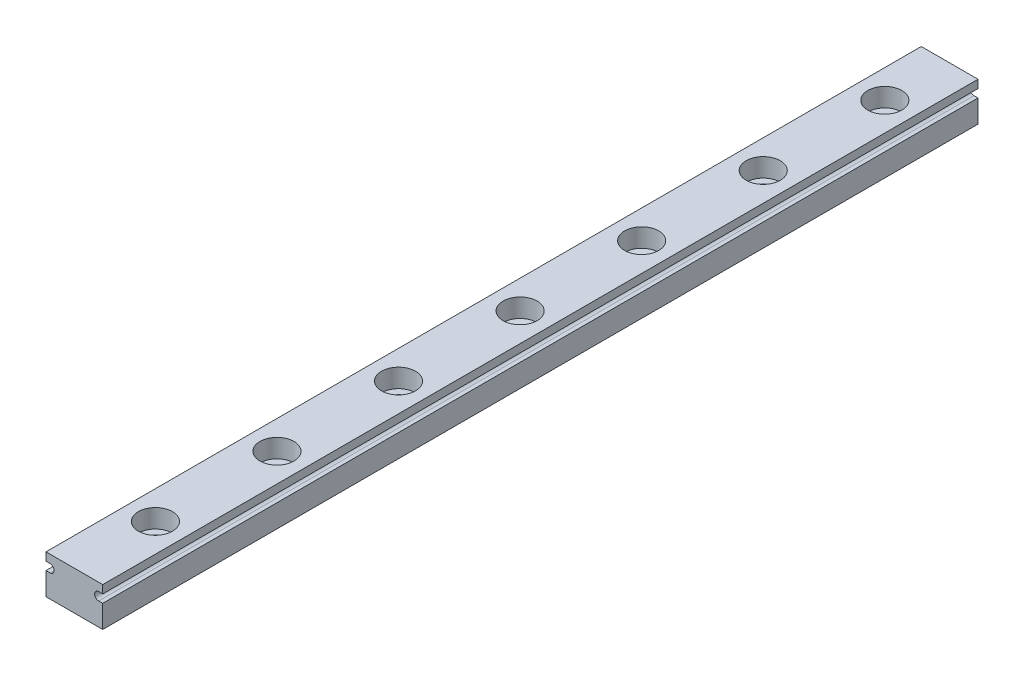
ISO-10303-21;
HEADER;
FILE_DESCRIPTION(('STEP AP214'),'2;1');
FILE_NAME('part.step','',(''),(''),'','','');
FILE_SCHEMA(('AUTOMOTIVE_DESIGN { 1 0 10303 214 1 1 1 1 }'));
ENDSEC;
DATA;
#1=APPLICATION_CONTEXT('core data for automotive mechanical design processes');
#2=APPLICATION_PROTOCOL_DEFINITION('international standard','automotive_design',2000,#1);
#3=PRODUCT_CONTEXT('',#1,'mechanical');
#4=PRODUCT('Part','Part','',(#3));
#5=PRODUCT_RELATED_PRODUCT_CATEGORY('part','',(#4));
#6=PRODUCT_DEFINITION_FORMATION('','',#4);
#7=PRODUCT_DEFINITION_CONTEXT('part definition',#1,'design');
#8=PRODUCT_DEFINITION('design','',#6,#7);
#9=PRODUCT_DEFINITION_SHAPE('','',#8);
#10=(LENGTH_UNIT() NAMED_UNIT(*) SI_UNIT(.MILLI.,.METRE.));
#11=(NAMED_UNIT(*) PLANE_ANGLE_UNIT() SI_UNIT($,.RADIAN.));
#12=(NAMED_UNIT(*) SI_UNIT($,.STERADIAN.) SOLID_ANGLE_UNIT());
#13=UNCERTAINTY_MEASURE_WITH_UNIT(LENGTH_MEASURE(1.E-05),#10,'distance_accuracy_value','');
#14=(GEOMETRIC_REPRESENTATION_CONTEXT(3) GLOBAL_UNCERTAINTY_ASSIGNED_CONTEXT((#13)) GLOBAL_UNIT_ASSIGNED_CONTEXT((#10,
#11,#12)) REPRESENTATION_CONTEXT('',''));
#15=CARTESIAN_POINT('',(0.,0.,0.));
#16=DIRECTION('',(0.,0.,1.));
#17=DIRECTION('',(1.,0.,0.));
#18=AXIS2_PLACEMENT_3D('',#15,#16,#17);
#19=CARTESIAN_POINT('',(-3.5,2.8,-108.));
#20=DIRECTION('',(-1.,0.,0.));
#21=DIRECTION('',(0.,-1.,0.));
#22=AXIS2_PLACEMENT_3D('',#19,#20,#21);
#23=PLANE('',#22);
#24=DIRECTION('',(0.,-1.,0.));
#25=VECTOR('',#24,1.);
#26=CARTESIAN_POINT('',(-3.5,2.8,0.));
#27=LINE('',#26,#25);
#28=CARTESIAN_POINT('',(-3.5,2.8,0.));
#29=VERTEX_POINT('',#28);
#30=CARTESIAN_POINT('',(-3.5,0.,0.));
#31=VERTEX_POINT('',#30);
#32=EDGE_CURVE('E155',#29,#31,#27,.T.);
#33=ORIENTED_EDGE('',*,*,#32,.F.);
#34=DIRECTION('',(0.,0.,1.));
#35=VECTOR('',#34,1.);
#36=CARTESIAN_POINT('',(-3.5,2.8,-108.));
#37=LINE('',#36,#35);
#38=CARTESIAN_POINT('',(-3.5,2.8,-108.));
#39=VERTEX_POINT('',#38);
#40=EDGE_CURVE('E11',#39,#29,#37,.T.);
#41=ORIENTED_EDGE('',*,*,#40,.F.);
#42=DIRECTION('',(0.,-1.,0.));
#43=VECTOR('',#42,1.);
#44=CARTESIAN_POINT('',(-3.5,2.8,-108.));
#45=LINE('',#44,#43);
#46=CARTESIAN_POINT('',(-3.5,0.,-108.));
#47=VERTEX_POINT('',#46);
#48=EDGE_CURVE('E188',#39,#47,#45,.T.);
#49=ORIENTED_EDGE('',*,*,#48,.T.);
#50=DIRECTION('',(0.,0.,1.));
#51=VECTOR('',#50,1.);
#52=CARTESIAN_POINT('',(-3.5,0.,-108.));
#53=LINE('',#52,#51);
#54=EDGE_CURVE('E37',#47,#31,#53,.T.);
#55=ORIENTED_EDGE('',*,*,#54,.T.);
#56=EDGE_LOOP('',(#33,#41,#49,#55));
#57=FACE_BOUND('',#56,.T.);
#58=ADVANCED_FACE('F34',(#57),#23,.T.);
#59=CARTESIAN_POINT('',(-3.,2.8,-108.));
#60=DIRECTION('',(0.,1.,0.));
#61=DIRECTION('',(0.,0.,1.));
#62=AXIS2_PLACEMENT_3D('',#59,#60,#61);
#63=PLANE('',#62);
#64=DIRECTION('',(-1.,0.,0.));
#65=VECTOR('',#64,1.);
#66=CARTESIAN_POINT('',(-3.,2.8,0.));
#67=LINE('',#66,#65);
#68=CARTESIAN_POINT('',(-3.,2.8,0.));
#69=VERTEX_POINT('',#68);
#70=EDGE_CURVE('E186',#69,#29,#67,.T.);
#71=ORIENTED_EDGE('',*,*,#70,.F.);
#72=DIRECTION('',(0.,0.,1.));
#73=VECTOR('',#72,1.);
#74=CARTESIAN_POINT('',(-3.,2.8,-108.));
#75=LINE('',#74,#73);
#76=CARTESIAN_POINT('',(-3.,2.8,-108.));
#77=VERTEX_POINT('',#76);
#78=EDGE_CURVE('E43',#77,#69,#75,.T.);
#79=ORIENTED_EDGE('',*,*,#78,.F.);
#80=DIRECTION('',(-1.,0.,0.));
#81=VECTOR('',#80,1.);
#82=CARTESIAN_POINT('',(-3.,2.8,-108.));
#83=LINE('',#82,#81);
#84=EDGE_CURVE('E145',#77,#39,#83,.T.);
#85=ORIENTED_EDGE('',*,*,#84,.T.);
#86=ORIENTED_EDGE('',*,*,#40,.T.);
#87=EDGE_LOOP('',(#71,#79,#85,#86));
#88=FACE_BOUND('',#87,.T.);
#89=ADVANCED_FACE('F208',(#88),#63,.T.);
#90=CARTESIAN_POINT('',(-3.,3.3,-108.));
#91=DIRECTION('',(0.,0.,1.));
#92=DIRECTION('',(1.,0.,0.));
#93=AXIS2_PLACEMENT_3D('',#90,#91,#92);
#94=CYLINDRICAL_SURFACE('',#93,0.5);
#95=CARTESIAN_POINT('',(-3.,3.3,0.));
#96=DIRECTION('',(0.,0.,-1.));
#97=DIRECTION('',(-1.,0.,0.));
#98=AXIS2_PLACEMENT_3D('',#95,#96,#97);
#99=CIRCLE('',#98,0.5);
#100=CARTESIAN_POINT('',(-3.,3.8,0.));
#101=VERTEX_POINT('',#100);
#102=EDGE_CURVE('E132',#101,#69,#99,.T.);
#103=ORIENTED_EDGE('',*,*,#102,.F.);
#104=DIRECTION('',(0.,0.,1.));
#105=VECTOR('',#104,1.);
#106=CARTESIAN_POINT('',(-3.,3.8,-108.));
#107=LINE('',#106,#105);
#108=CARTESIAN_POINT('',(-3.,3.8,-108.));
#109=VERTEX_POINT('',#108);
#110=EDGE_CURVE('E127',#109,#101,#107,.T.);
#111=ORIENTED_EDGE('',*,*,#110,.F.);
#112=CARTESIAN_POINT('',(-3.,3.3,-108.));
#113=DIRECTION('',(0.,0.,-1.));
#114=DIRECTION('',(-1.,0.,0.));
#115=AXIS2_PLACEMENT_3D('',#112,#113,#114);
#116=CIRCLE('',#115,0.5);
#117=EDGE_CURVE('E130',#109,#77,#116,.T.);
#118=ORIENTED_EDGE('',*,*,#117,.T.);
#119=ORIENTED_EDGE('',*,*,#78,.T.);
#120=EDGE_LOOP('',(#103,#111,#118,#119));
#121=FACE_BOUND('',#120,.T.);
#122=ADVANCED_FACE('F129',(#121),#94,.F.);
#123=CARTESIAN_POINT('',(-3.,3.8,-108.));
#124=DIRECTION('',(0.,-1.,0.));
#125=DIRECTION('',(0.,0.,-1.));
#126=AXIS2_PLACEMENT_3D('',#123,#124,#125);
#127=PLANE('',#126);
#128=DIRECTION('',(1.,0.,0.));
#129=VECTOR('',#128,1.);
#130=CARTESIAN_POINT('',(-3.,3.8,0.));
#131=LINE('',#130,#129);
#132=CARTESIAN_POINT('',(-3.5,3.8,0.));
#133=VERTEX_POINT('',#132);
#134=EDGE_CURVE('E183',#133,#101,#131,.T.);
#135=ORIENTED_EDGE('',*,*,#134,.F.);
#136=DIRECTION('',(0.,0.,1.));
#137=VECTOR('',#136,1.);
#138=CARTESIAN_POINT('',(-3.5,3.8,-108.));
#139=LINE('',#138,#137);
#140=CARTESIAN_POINT('',(-3.5,3.8,-108.));
#141=VERTEX_POINT('',#140);
#142=EDGE_CURVE('E137',#141,#133,#139,.T.);
#143=ORIENTED_EDGE('',*,*,#142,.F.);
#144=DIRECTION('',(1.,0.,0.));
#145=VECTOR('',#144,1.);
#146=CARTESIAN_POINT('',(-3.,3.8,-108.));
#147=LINE('',#146,#145);
#148=EDGE_CURVE('E143',#141,#109,#147,.T.);
#149=ORIENTED_EDGE('',*,*,#148,.T.);
#150=ORIENTED_EDGE('',*,*,#110,.T.);
#151=EDGE_LOOP('',(#135,#143,#149,#150));
#152=FACE_BOUND('',#151,.T.);
#153=ADVANCED_FACE('F147',(#152),#127,.T.);
#154=CARTESIAN_POINT('',(-3.5,4.8,-108.));
#155=DIRECTION('',(-1.,0.,0.));
#156=DIRECTION('',(0.,-1.,0.));
#157=AXIS2_PLACEMENT_3D('',#154,#155,#156);
#158=PLANE('',#157);
#159=DIRECTION('',(0.,-1.,0.));
#160=VECTOR('',#159,1.);
#161=CARTESIAN_POINT('',(-3.5,4.8,0.));
#162=LINE('',#161,#160);
#163=CARTESIAN_POINT('',(-3.5,4.8,0.));
#164=VERTEX_POINT('',#163);
#165=EDGE_CURVE('E180',#164,#133,#162,.T.);
#166=ORIENTED_EDGE('',*,*,#165,.F.);
#167=DIRECTION('',(0.,0.,1.));
#168=VECTOR('',#167,1.);
#169=CARTESIAN_POINT('',(-3.5,4.8,-108.));
#170=LINE('',#169,#168);
#171=CARTESIAN_POINT('',(-3.5,4.8,-108.));
#172=VERTEX_POINT('',#171);
#173=EDGE_CURVE('E192',#172,#164,#170,.T.);
#174=ORIENTED_EDGE('',*,*,#173,.F.);
#175=DIRECTION('',(0.,-1.,0.));
#176=VECTOR('',#175,1.);
#177=CARTESIAN_POINT('',(-3.5,4.8,-108.));
#178=LINE('',#177,#176);
#179=EDGE_CURVE('E148',#172,#141,#178,.T.);
#180=ORIENTED_EDGE('',*,*,#179,.T.);
#181=ORIENTED_EDGE('',*,*,#142,.T.);
#182=EDGE_LOOP('',(#166,#174,#180,#181));
#183=FACE_BOUND('',#182,.T.);
#184=ADVANCED_FACE('F221',(#183),#158,.T.);
#185=CARTESIAN_POINT('',(-3.5,4.8,-108.));
#186=DIRECTION('',(0.,1.,0.));
#187=DIRECTION('',(0.,0.,1.));
#188=AXIS2_PLACEMENT_3D('',#185,#186,#187);
#189=PLANE('',#188);
#190=CARTESIAN_POINT('',(0.,4.8,-100.));
#191=DIRECTION('',(0.,1.,0.));
#192=DIRECTION('',(0.,0.,1.));
#193=AXIS2_PLACEMENT_3D('',#190,#191,#192);
#194=CIRCLE('',#193,2.1);
#195=CARTESIAN_POINT('',(0.,4.8,-97.9));
#196=VERTEX_POINT('',#195);
#197=EDGE_CURVE('E426',#196,#196,#194,.T.);
#198=ORIENTED_EDGE('',*,*,#197,.F.);
#199=EDGE_LOOP('',(#198));
#200=FACE_BOUND('',#199,.T.);
#201=CARTESIAN_POINT('',(0.,4.8,-85.));
#202=DIRECTION('',(0.,1.,0.));
#203=DIRECTION('',(0.,0.,1.));
#204=AXIS2_PLACEMENT_3D('',#201,#202,#203);
#205=CIRCLE('',#204,2.1);
#206=CARTESIAN_POINT('',(0.,4.8,-82.9));
#207=VERTEX_POINT('',#206);
#208=EDGE_CURVE('E439',#207,#207,#205,.T.);
#209=ORIENTED_EDGE('',*,*,#208,.F.);
#210=EDGE_LOOP('',(#209));
#211=FACE_BOUND('',#210,.T.);
#212=CARTESIAN_POINT('',(0.,4.8,-70.));
#213=DIRECTION('',(0.,1.,0.));
#214=DIRECTION('',(0.,0.,1.));
#215=AXIS2_PLACEMENT_3D('',#212,#213,#214);
#216=CIRCLE('',#215,2.1);
#217=CARTESIAN_POINT('',(0.,4.8,-67.9));
#218=VERTEX_POINT('',#217);
#219=EDGE_CURVE('E449',#218,#218,#216,.T.);
#220=ORIENTED_EDGE('',*,*,#219,.F.);
#221=EDGE_LOOP('',(#220));
#222=FACE_BOUND('',#221,.T.);
#223=CARTESIAN_POINT('',(0.,4.8,-55.));
#224=DIRECTION('',(0.,1.,0.));
#225=DIRECTION('',(0.,0.,1.));
#226=AXIS2_PLACEMENT_3D('',#223,#224,#225);
#227=CIRCLE('',#226,2.1);
#228=CARTESIAN_POINT('',(0.,4.8,-52.9));
#229=VERTEX_POINT('',#228);
#230=EDGE_CURVE('E459',#229,#229,#227,.T.);
#231=ORIENTED_EDGE('',*,*,#230,.F.);
#232=EDGE_LOOP('',(#231));
#233=FACE_BOUND('',#232,.T.);
#234=CARTESIAN_POINT('',(0.,4.8,-40.));
#235=DIRECTION('',(0.,1.,0.));
#236=DIRECTION('',(0.,0.,1.));
#237=AXIS2_PLACEMENT_3D('',#234,#235,#236);
#238=CIRCLE('',#237,2.1);
#239=CARTESIAN_POINT('',(0.,4.8,-37.9));
#240=VERTEX_POINT('',#239);
#241=EDGE_CURVE('E469',#240,#240,#238,.T.);
#242=ORIENTED_EDGE('',*,*,#241,.F.);
#243=EDGE_LOOP('',(#242));
#244=FACE_BOUND('',#243,.T.);
#245=CARTESIAN_POINT('',(0.,4.8,-25.));
#246=DIRECTION('',(0.,1.,0.));
#247=DIRECTION('',(0.,0.,1.));
#248=AXIS2_PLACEMENT_3D('',#245,#246,#247);
#249=CIRCLE('',#248,2.1);
#250=CARTESIAN_POINT('',(0.,4.8,-22.9));
#251=VERTEX_POINT('',#250);
#252=EDGE_CURVE('E282',#251,#251,#249,.T.);
#253=ORIENTED_EDGE('',*,*,#252,.F.);
#254=EDGE_LOOP('',(#253));
#255=FACE_BOUND('',#254,.T.);
#256=CARTESIAN_POINT('',(0.,4.8,-9.99999999999999));
#257=DIRECTION('',(0.,1.,0.));
#258=DIRECTION('',(0.,0.,1.));
#259=AXIS2_PLACEMENT_3D('',#256,#257,#258);
#260=CIRCLE('',#259,2.1);
#261=CARTESIAN_POINT('',(0.,4.8,-7.89999999999999));
#262=VERTEX_POINT('',#261);
#263=EDGE_CURVE('E159',#262,#262,#260,.T.);
#264=ORIENTED_EDGE('',*,*,#263,.F.);
#265=EDGE_LOOP('',(#264));
#266=FACE_BOUND('',#265,.T.);
#267=DIRECTION('',(-1.,0.,0.));
#268=VECTOR('',#267,1.);
#269=CARTESIAN_POINT('',(-3.5,4.8,0.));
#270=LINE('',#269,#268);
#271=CARTESIAN_POINT('',(3.5,4.8,0.));
#272=VERTEX_POINT('',#271);
#273=EDGE_CURVE('E177',#272,#164,#270,.T.);
#274=ORIENTED_EDGE('',*,*,#273,.F.);
#275=DIRECTION('',(0.,0.,1.));
#276=VECTOR('',#275,1.);
#277=CARTESIAN_POINT('',(3.5,4.8,-108.));
#278=LINE('',#277,#276);
#279=CARTESIAN_POINT('',(3.5,4.8,-108.));
#280=VERTEX_POINT('',#279);
#281=EDGE_CURVE('E194',#280,#272,#278,.T.);
#282=ORIENTED_EDGE('',*,*,#281,.F.);
#283=DIRECTION('',(-1.,0.,0.));
#284=VECTOR('',#283,1.);
#285=CARTESIAN_POINT('',(-3.5,4.8,-108.));
#286=LINE('',#285,#284);
#287=EDGE_CURVE('E150',#280,#172,#286,.T.);
#288=ORIENTED_EDGE('',*,*,#287,.T.);
#289=ORIENTED_EDGE('',*,*,#173,.T.);
#290=EDGE_LOOP('',(#274,#282,#288,#289));
#291=FACE_BOUND('',#290,.T.);
#292=ADVANCED_FACE('F224',(#200,#211,#222,#233,#244,#255,#266,#291),#189,.T.);
#293=CARTESIAN_POINT('',(3.5,4.8,-108.));
#294=DIRECTION('',(1.,0.,0.));
#295=DIRECTION('',(0.,1.,0.));
#296=AXIS2_PLACEMENT_3D('',#293,#294,#295);
#297=PLANE('',#296);
#298=DIRECTION('',(0.,1.,0.));
#299=VECTOR('',#298,1.);
#300=CARTESIAN_POINT('',(3.5,4.8,0.));
#301=LINE('',#300,#299);
#302=CARTESIAN_POINT('',(3.5,3.8,0.));
#303=VERTEX_POINT('',#302);
#304=EDGE_CURVE('E174',#303,#272,#301,.T.);
#305=ORIENTED_EDGE('',*,*,#304,.F.);
#306=DIRECTION('',(0.,0.,1.));
#307=VECTOR('',#306,1.);
#308=CARTESIAN_POINT('',(3.5,3.8,-108.));
#309=LINE('',#308,#307);
#310=CARTESIAN_POINT('',(3.5,3.8,-108.));
#311=VERTEX_POINT('',#310);
#312=EDGE_CURVE('E196',#311,#303,#309,.T.);
#313=ORIENTED_EDGE('',*,*,#312,.F.);
#314=DIRECTION('',(0.,1.,0.));
#315=VECTOR('',#314,1.);
#316=CARTESIAN_POINT('',(3.5,4.8,-108.));
#317=LINE('',#316,#315);
#318=EDGE_CURVE('E311',#311,#280,#317,.T.);
#319=ORIENTED_EDGE('',*,*,#318,.T.);
#320=ORIENTED_EDGE('',*,*,#281,.T.);
#321=EDGE_LOOP('',(#305,#313,#319,#320));
#322=FACE_BOUND('',#321,.T.);
#323=ADVANCED_FACE('F228',(#322),#297,.T.);
#324=CARTESIAN_POINT('',(3.,3.8,-108.));
#325=DIRECTION('',(0.,-1.,0.));
#326=DIRECTION('',(0.,0.,-1.));
#327=AXIS2_PLACEMENT_3D('',#324,#325,#326);
#328=PLANE('',#327);
#329=DIRECTION('',(1.,0.,0.));
#330=VECTOR('',#329,1.);
#331=CARTESIAN_POINT('',(3.,3.8,0.));
#332=LINE('',#331,#330);
#333=CARTESIAN_POINT('',(3.,3.8,0.));
#334=VERTEX_POINT('',#333);
#335=EDGE_CURVE('E171',#334,#303,#332,.T.);
#336=ORIENTED_EDGE('',*,*,#335,.F.);
#337=DIRECTION('',(0.,0.,1.));
#338=VECTOR('',#337,1.);
#339=CARTESIAN_POINT('',(3.,3.8,-108.));
#340=LINE('',#339,#338);
#341=CARTESIAN_POINT('',(3.,3.8,-108.));
#342=VERTEX_POINT('',#341);
#343=EDGE_CURVE('E198',#342,#334,#340,.T.);
#344=ORIENTED_EDGE('',*,*,#343,.F.);
#345=DIRECTION('',(1.,0.,0.));
#346=VECTOR('',#345,1.);
#347=CARTESIAN_POINT('',(3.,3.8,-108.));
#348=LINE('',#347,#346);
#349=EDGE_CURVE('E308',#342,#311,#348,.T.);
#350=ORIENTED_EDGE('',*,*,#349,.T.);
#351=ORIENTED_EDGE('',*,*,#312,.T.);
#352=EDGE_LOOP('',(#336,#344,#350,#351));
#353=FACE_BOUND('',#352,.T.);
#354=ADVANCED_FACE('F232',(#353),#328,.T.);
#355=CARTESIAN_POINT('',(3.,3.3,-108.));
#356=DIRECTION('',(0.,0.,1.));
#357=DIRECTION('',(1.,0.,0.));
#358=AXIS2_PLACEMENT_3D('',#355,#356,#357);
#359=CYLINDRICAL_SURFACE('',#358,0.5);
#360=CARTESIAN_POINT('',(3.,3.3,0.));
#361=DIRECTION('',(0.,0.,-1.));
#362=DIRECTION('',(1.,0.,0.));
#363=AXIS2_PLACEMENT_3D('',#360,#361,#362);
#364=CIRCLE('',#363,0.5);
#365=CARTESIAN_POINT('',(3.,2.8,0.));
#366=VERTEX_POINT('',#365);
#367=EDGE_CURVE('E168',#366,#334,#364,.T.);
#368=ORIENTED_EDGE('',*,*,#367,.F.);
#369=DIRECTION('',(0.,0.,1.));
#370=VECTOR('',#369,1.);
#371=CARTESIAN_POINT('',(3.,2.8,-108.));
#372=LINE('',#371,#370);
#373=CARTESIAN_POINT('',(3.,2.8,-108.));
#374=VERTEX_POINT('',#373);
#375=EDGE_CURVE('E200',#374,#366,#372,.T.);
#376=ORIENTED_EDGE('',*,*,#375,.F.);
#377=CARTESIAN_POINT('',(3.,3.3,-108.));
#378=DIRECTION('',(0.,0.,-1.));
#379=DIRECTION('',(1.,0.,0.));
#380=AXIS2_PLACEMENT_3D('',#377,#378,#379);
#381=CIRCLE('',#380,0.5);
#382=EDGE_CURVE('E305',#374,#342,#381,.T.);
#383=ORIENTED_EDGE('',*,*,#382,.T.);
#384=ORIENTED_EDGE('',*,*,#343,.T.);
#385=EDGE_LOOP('',(#368,#376,#383,#384));
#386=FACE_BOUND('',#385,.T.);
#387=ADVANCED_FACE('F236',(#386),#359,.F.);
#388=CARTESIAN_POINT('',(3.,2.8,-108.));
#389=DIRECTION('',(0.,1.,0.));
#390=DIRECTION('',(0.,0.,1.));
#391=AXIS2_PLACEMENT_3D('',#388,#389,#390);
#392=PLANE('',#391);
#393=DIRECTION('',(-1.,0.,0.));
#394=VECTOR('',#393,1.);
#395=CARTESIAN_POINT('',(3.,2.8,0.));
#396=LINE('',#395,#394);
#397=CARTESIAN_POINT('',(3.5,2.8,0.));
#398=VERTEX_POINT('',#397);
#399=EDGE_CURVE('E165',#398,#366,#396,.T.);
#400=ORIENTED_EDGE('',*,*,#399,.F.);
#401=DIRECTION('',(0.,0.,1.));
#402=VECTOR('',#401,1.);
#403=CARTESIAN_POINT('',(3.5,2.8,-108.));
#404=LINE('',#403,#402);
#405=CARTESIAN_POINT('',(3.5,2.8,-108.));
#406=VERTEX_POINT('',#405);
#407=EDGE_CURVE('E202',#406,#398,#404,.T.);
#408=ORIENTED_EDGE('',*,*,#407,.F.);
#409=DIRECTION('',(-1.,0.,0.));
#410=VECTOR('',#409,1.);
#411=CARTESIAN_POINT('',(3.,2.8,-108.));
#412=LINE('',#411,#410);
#413=EDGE_CURVE('E302',#406,#374,#412,.T.);
#414=ORIENTED_EDGE('',*,*,#413,.T.);
#415=ORIENTED_EDGE('',*,*,#375,.T.);
#416=EDGE_LOOP('',(#400,#408,#414,#415));
#417=FACE_BOUND('',#416,.T.);
#418=ADVANCED_FACE('F240',(#417),#392,.T.);
#419=CARTESIAN_POINT('',(3.5,2.8,-108.));
#420=DIRECTION('',(1.,0.,0.));
#421=DIRECTION('',(0.,1.,0.));
#422=AXIS2_PLACEMENT_3D('',#419,#420,#421);
#423=PLANE('',#422);
#424=DIRECTION('',(0.,1.,0.));
#425=VECTOR('',#424,1.);
#426=CARTESIAN_POINT('',(3.5,2.8,0.));
#427=LINE('',#426,#425);
#428=CARTESIAN_POINT('',(3.5,0.,0.));
#429=VERTEX_POINT('',#428);
#430=EDGE_CURVE('E162',#429,#398,#427,.T.);
#431=ORIENTED_EDGE('',*,*,#430,.F.);
#432=DIRECTION('',(0.,0.,1.));
#433=VECTOR('',#432,1.);
#434=CARTESIAN_POINT('',(3.5,0.,-108.));
#435=LINE('',#434,#433);
#436=CARTESIAN_POINT('',(3.5,0.,-108.));
#437=VERTEX_POINT('',#436);
#438=EDGE_CURVE('E203',#437,#429,#435,.T.);
#439=ORIENTED_EDGE('',*,*,#438,.F.);
#440=DIRECTION('',(0.,1.,0.));
#441=VECTOR('',#440,1.);
#442=CARTESIAN_POINT('',(3.5,2.8,-108.));
#443=LINE('',#442,#441);
#444=EDGE_CURVE('E299',#437,#406,#443,.T.);
#445=ORIENTED_EDGE('',*,*,#444,.T.);
#446=ORIENTED_EDGE('',*,*,#407,.T.);
#447=EDGE_LOOP('',(#431,#439,#445,#446));
#448=FACE_BOUND('',#447,.T.);
#449=ADVANCED_FACE('F244',(#448),#423,.T.);
#450=CARTESIAN_POINT('',(-3.5,0.,-108.));
#451=DIRECTION('',(0.,-1.,0.));
#452=DIRECTION('',(0.,0.,-1.));
#453=AXIS2_PLACEMENT_3D('',#450,#451,#452);
#454=PLANE('',#453);
#455=CARTESIAN_POINT('',(0.,0.,-100.));
#456=DIRECTION('',(0.,1.,0.));
#457=DIRECTION('',(0.,0.,1.));
#458=AXIS2_PLACEMENT_3D('',#455,#456,#457);
#459=CIRCLE('',#458,1.19999999999999);
#460=CARTESIAN_POINT('',(0.,0.,-98.8));
#461=VERTEX_POINT('',#460);
#462=EDGE_CURVE('E256',#461,#461,#459,.T.);
#463=ORIENTED_EDGE('',*,*,#462,.T.);
#464=EDGE_LOOP('',(#463));
#465=FACE_BOUND('',#464,.T.);
#466=CARTESIAN_POINT('',(0.,0.,-85.));
#467=DIRECTION('',(0.,1.,0.));
#468=DIRECTION('',(0.,0.,1.));
#469=AXIS2_PLACEMENT_3D('',#466,#467,#468);
#470=CIRCLE('',#469,1.19999999999999);
#471=CARTESIAN_POINT('',(0.,0.,-83.8));
#472=VERTEX_POINT('',#471);
#473=EDGE_CURVE('E260',#472,#472,#470,.T.);
#474=ORIENTED_EDGE('',*,*,#473,.T.);
#475=EDGE_LOOP('',(#474));
#476=FACE_BOUND('',#475,.T.);
#477=CARTESIAN_POINT('',(0.,0.,-70.));
#478=DIRECTION('',(0.,1.,0.));
#479=DIRECTION('',(0.,0.,1.));
#480=AXIS2_PLACEMENT_3D('',#477,#478,#479);
#481=CIRCLE('',#480,1.19999999999999);
#482=CARTESIAN_POINT('',(0.,0.,-68.8));
#483=VERTEX_POINT('',#482);
#484=EDGE_CURVE('E264',#483,#483,#481,.T.);
#485=ORIENTED_EDGE('',*,*,#484,.T.);
#486=EDGE_LOOP('',(#485));
#487=FACE_BOUND('',#486,.T.);
#488=CARTESIAN_POINT('',(0.,0.,-55.));
#489=DIRECTION('',(0.,1.,0.));
#490=DIRECTION('',(0.,0.,1.));
#491=AXIS2_PLACEMENT_3D('',#488,#489,#490);
#492=CIRCLE('',#491,1.19999999999999);
#493=CARTESIAN_POINT('',(0.,0.,-53.8));
#494=VERTEX_POINT('',#493);
#495=EDGE_CURVE('E268',#494,#494,#492,.T.);
#496=ORIENTED_EDGE('',*,*,#495,.T.);
#497=EDGE_LOOP('',(#496));
#498=FACE_BOUND('',#497,.T.);
#499=CARTESIAN_POINT('',(0.,0.,-40.));
#500=DIRECTION('',(0.,1.,0.));
#501=DIRECTION('',(0.,0.,1.));
#502=AXIS2_PLACEMENT_3D('',#499,#500,#501);
#503=CIRCLE('',#502,1.19999999999999);
#504=CARTESIAN_POINT('',(0.,0.,-38.8));
#505=VERTEX_POINT('',#504);
#506=EDGE_CURVE('E272',#505,#505,#503,.T.);
#507=ORIENTED_EDGE('',*,*,#506,.T.);
#508=EDGE_LOOP('',(#507));
#509=FACE_BOUND('',#508,.T.);
#510=CARTESIAN_POINT('',(0.,0.,-25.));
#511=DIRECTION('',(0.,1.,0.));
#512=DIRECTION('',(0.,0.,1.));
#513=AXIS2_PLACEMENT_3D('',#510,#511,#512);
#514=CIRCLE('',#513,1.19999999999999);
#515=CARTESIAN_POINT('',(0.,0.,-23.8));
#516=VERTEX_POINT('',#515);
#517=EDGE_CURVE('E276',#516,#516,#514,.T.);
#518=ORIENTED_EDGE('',*,*,#517,.T.);
#519=EDGE_LOOP('',(#518));
#520=FACE_BOUND('',#519,.T.);
#521=CARTESIAN_POINT('',(0.,0.,-9.99999999999999));
#522=DIRECTION('',(0.,1.,0.));
#523=DIRECTION('',(0.,0.,1.));
#524=AXIS2_PLACEMENT_3D('',#521,#522,#523);
#525=CIRCLE('',#524,1.19999999999999);
#526=CARTESIAN_POINT('',(0.,0.,-8.8));
#527=VERTEX_POINT('',#526);
#528=EDGE_CURVE('E279',#527,#527,#525,.T.);
#529=ORIENTED_EDGE('',*,*,#528,.T.);
#530=EDGE_LOOP('',(#529));
#531=FACE_BOUND('',#530,.T.);
#532=DIRECTION('',(1.,0.,0.));
#533=VECTOR('',#532,1.);
#534=CARTESIAN_POINT('',(-3.5,0.,0.));
#535=LINE('',#534,#533);
#536=EDGE_CURVE('E158',#31,#429,#535,.T.);
#537=ORIENTED_EDGE('',*,*,#536,.F.);
#538=ORIENTED_EDGE('',*,*,#54,.F.);
#539=DIRECTION('',(1.,0.,0.));
#540=VECTOR('',#539,1.);
#541=CARTESIAN_POINT('',(-3.5,0.,-108.));
#542=LINE('',#541,#540);
#543=EDGE_CURVE('E297',#47,#437,#542,.T.);
#544=ORIENTED_EDGE('',*,*,#543,.T.);
#545=ORIENTED_EDGE('',*,*,#438,.T.);
#546=EDGE_LOOP('',(#537,#538,#544,#545));
#547=FACE_BOUND('',#546,.T.);
#548=ADVANCED_FACE('F205',(#465,#476,#487,#498,#509,#520,#531,#547),#454,.T.);
#549=CARTESIAN_POINT('',(3.,3.3,-108.));
#550=DIRECTION('',(0.,0.,1.));
#551=DIRECTION('',(1.,0.,0.));
#552=AXIS2_PLACEMENT_3D('',#549,#550,#551);
#553=PLANE('',#552);
#554=ORIENTED_EDGE('',*,*,#48,.F.);
#555=ORIENTED_EDGE('',*,*,#84,.F.);
#556=ORIENTED_EDGE('',*,*,#117,.F.);
#557=ORIENTED_EDGE('',*,*,#148,.F.);
#558=ORIENTED_EDGE('',*,*,#179,.F.);
#559=ORIENTED_EDGE('',*,*,#287,.F.);
#560=ORIENTED_EDGE('',*,*,#318,.F.);
#561=ORIENTED_EDGE('',*,*,#349,.F.);
#562=ORIENTED_EDGE('',*,*,#382,.F.);
#563=ORIENTED_EDGE('',*,*,#413,.F.);
#564=ORIENTED_EDGE('',*,*,#444,.F.);
#565=ORIENTED_EDGE('',*,*,#543,.F.);
#566=EDGE_LOOP('',(#554,#555,#556,#557,#558,#559,#560,#561,#562,#563,#564,#565));
#567=FACE_BOUND('',#566,.T.);
#568=ADVANCED_FACE('F141',(#567),#553,.F.);
#569=CARTESIAN_POINT('',(3.,3.3,0.));
#570=DIRECTION('',(0.,0.,1.));
#571=DIRECTION('',(1.,0.,0.));
#572=AXIS2_PLACEMENT_3D('',#569,#570,#571);
#573=PLANE('',#572);
#574=ORIENTED_EDGE('',*,*,#32,.T.);
#575=ORIENTED_EDGE('',*,*,#536,.T.);
#576=ORIENTED_EDGE('',*,*,#430,.T.);
#577=ORIENTED_EDGE('',*,*,#399,.T.);
#578=ORIENTED_EDGE('',*,*,#367,.T.);
#579=ORIENTED_EDGE('',*,*,#335,.T.);
#580=ORIENTED_EDGE('',*,*,#304,.T.);
#581=ORIENTED_EDGE('',*,*,#273,.T.);
#582=ORIENTED_EDGE('',*,*,#165,.T.);
#583=ORIENTED_EDGE('',*,*,#134,.T.);
#584=ORIENTED_EDGE('',*,*,#102,.T.);
#585=ORIENTED_EDGE('',*,*,#70,.T.);
#586=EDGE_LOOP('',(#574,#575,#576,#577,#578,#579,#580,#581,#582,#583,#584,#585));
#587=FACE_BOUND('',#586,.T.);
#588=ADVANCED_FACE('F207',(#587),#573,.T.);
#589=CARTESIAN_POINT('',(0.,4.8,-9.99999999999999));
#590=DIRECTION('',(0.,1.,0.));
#591=DIRECTION('',(0.,0.,1.));
#592=AXIS2_PLACEMENT_3D('',#589,#590,#591);
#593=CYLINDRICAL_SURFACE('',#592,2.1);
#594=CARTESIAN_POINT('',(0.,2.5,-9.99999999999999));
#595=DIRECTION('',(0.,1.,0.));
#596=DIRECTION('',(0.,0.,1.));
#597=AXIS2_PLACEMENT_3D('',#594,#595,#596);
#598=CIRCLE('',#597,2.1);
#599=CARTESIAN_POINT('',(0.,2.5,-7.89999999999999));
#600=VERTEX_POINT('',#599);
#601=EDGE_CURVE('E285',#600,#600,#598,.T.);
#602=ORIENTED_EDGE('',*,*,#601,.F.);
#603=EDGE_LOOP('',(#602));
#604=FACE_BOUND('',#603,.T.);
#605=ORIENTED_EDGE('',*,*,#263,.T.);
#606=EDGE_LOOP('',(#605));
#607=FACE_BOUND('',#606,.T.);
#608=ADVANCED_FACE('F329',(#604,#607),#593,.F.);
#609=CARTESIAN_POINT('',(0.,2.5,-7.89999999999999));
#610=DIRECTION('',(0.,-1.,0.));
#611=DIRECTION('',(0.,0.,-1.));
#612=AXIS2_PLACEMENT_3D('',#609,#610,#611);
#613=PLANE('',#612);
#614=CARTESIAN_POINT('',(0.,2.5,-9.99999999999999));
#615=DIRECTION('',(0.,1.,0.));
#616=DIRECTION('',(0.,0.,1.));
#617=AXIS2_PLACEMENT_3D('',#614,#615,#616);
#618=CIRCLE('',#617,1.19999999999999);
#619=CARTESIAN_POINT('',(0.,2.5,-8.8));
#620=VERTEX_POINT('',#619);
#621=EDGE_CURVE('E281',#620,#620,#618,.T.);
#622=ORIENTED_EDGE('',*,*,#621,.F.);
#623=EDGE_LOOP('',(#622));
#624=FACE_BOUND('',#623,.T.);
#625=ORIENTED_EDGE('',*,*,#601,.T.);
#626=EDGE_LOOP('',(#625));
#627=FACE_BOUND('',#626,.T.);
#628=ADVANCED_FACE('F332',(#624,#627),#613,.F.);
#629=CARTESIAN_POINT('',(0.,4.8,-9.99999999999999));
#630=DIRECTION('',(0.,1.,0.));
#631=DIRECTION('',(0.,0.,1.));
#632=AXIS2_PLACEMENT_3D('',#629,#630,#631);
#633=CYLINDRICAL_SURFACE('',#632,1.19999999999999);
#634=ORIENTED_EDGE('',*,*,#528,.F.);
#635=EDGE_LOOP('',(#634));
#636=FACE_BOUND('',#635,.T.);
#637=ORIENTED_EDGE('',*,*,#621,.T.);
#638=EDGE_LOOP('',(#637));
#639=FACE_BOUND('',#638,.T.);
#640=ADVANCED_FACE('F339',(#636,#639),#633,.F.);
#641=CARTESIAN_POINT('',(0.,4.8,-25.));
#642=DIRECTION('',(0.,1.,0.));
#643=DIRECTION('',(0.,0.,1.));
#644=AXIS2_PLACEMENT_3D('',#641,#642,#643);
#645=CYLINDRICAL_SURFACE('',#644,2.1);
#646=CARTESIAN_POINT('',(0.,2.5,-25.));
#647=DIRECTION('',(0.,1.,0.));
#648=DIRECTION('',(0.,0.,1.));
#649=AXIS2_PLACEMENT_3D('',#646,#647,#648);
#650=CIRCLE('',#649,2.1);
#651=CARTESIAN_POINT('',(0.,2.5,-22.9));
#652=VERTEX_POINT('',#651);
#653=EDGE_CURVE('E288',#652,#652,#650,.T.);
#654=ORIENTED_EDGE('',*,*,#653,.F.);
#655=EDGE_LOOP('',(#654));
#656=FACE_BOUND('',#655,.T.);
#657=ORIENTED_EDGE('',*,*,#252,.T.);
#658=EDGE_LOOP('',(#657));
#659=FACE_BOUND('',#658,.T.);
#660=ADVANCED_FACE('F346',(#656,#659),#645,.F.);
#661=CARTESIAN_POINT('',(0.,2.5,-22.9));
#662=DIRECTION('',(0.,-1.,0.));
#663=DIRECTION('',(0.,0.,-1.));
#664=AXIS2_PLACEMENT_3D('',#661,#662,#663);
#665=PLANE('',#664);
#666=CARTESIAN_POINT('',(0.,2.5,-25.));
#667=DIRECTION('',(0.,1.,0.));
#668=DIRECTION('',(0.,0.,1.));
#669=AXIS2_PLACEMENT_3D('',#666,#667,#668);
#670=CIRCLE('',#669,1.19999999999999);
#671=CARTESIAN_POINT('',(0.,2.5,-23.8));
#672=VERTEX_POINT('',#671);
#673=EDGE_CURVE('E473',#672,#672,#670,.T.);
#674=ORIENTED_EDGE('',*,*,#673,.F.);
#675=EDGE_LOOP('',(#674));
#676=FACE_BOUND('',#675,.T.);
#677=ORIENTED_EDGE('',*,*,#653,.T.);
#678=EDGE_LOOP('',(#677));
#679=FACE_BOUND('',#678,.T.);
#680=ADVANCED_FACE('F349',(#676,#679),#665,.F.);
#681=CARTESIAN_POINT('',(0.,4.8,-25.));
#682=DIRECTION('',(0.,1.,0.));
#683=DIRECTION('',(0.,0.,1.));
#684=AXIS2_PLACEMENT_3D('',#681,#682,#683);
#685=CYLINDRICAL_SURFACE('',#684,1.19999999999999);
#686=ORIENTED_EDGE('',*,*,#517,.F.);
#687=EDGE_LOOP('',(#686));
#688=FACE_BOUND('',#687,.T.);
#689=ORIENTED_EDGE('',*,*,#673,.T.);
#690=EDGE_LOOP('',(#689));
#691=FACE_BOUND('',#690,.T.);
#692=ADVANCED_FACE('F353',(#688,#691),#685,.F.);
#693=CARTESIAN_POINT('',(0.,4.8,-40.));
#694=DIRECTION('',(0.,1.,0.));
#695=DIRECTION('',(0.,0.,1.));
#696=AXIS2_PLACEMENT_3D('',#693,#694,#695);
#697=CYLINDRICAL_SURFACE('',#696,2.1);
#698=CARTESIAN_POINT('',(0.,2.5,-40.));
#699=DIRECTION('',(0.,1.,0.));
#700=DIRECTION('',(0.,0.,1.));
#701=AXIS2_PLACEMENT_3D('',#698,#699,#700);
#702=CIRCLE('',#701,2.1);
#703=CARTESIAN_POINT('',(0.,2.5,-37.9));
#704=VERTEX_POINT('',#703);
#705=EDGE_CURVE('E466',#704,#704,#702,.T.);
#706=ORIENTED_EDGE('',*,*,#705,.F.);
#707=EDGE_LOOP('',(#706));
#708=FACE_BOUND('',#707,.T.);
#709=ORIENTED_EDGE('',*,*,#241,.T.);
#710=EDGE_LOOP('',(#709));
#711=FACE_BOUND('',#710,.T.);
#712=ADVANCED_FACE('F357',(#708,#711),#697,.F.);
#713=CARTESIAN_POINT('',(0.,2.5,-37.9));
#714=DIRECTION('',(0.,-1.,0.));
#715=DIRECTION('',(0.,0.,-1.));
#716=AXIS2_PLACEMENT_3D('',#713,#714,#715);
#717=PLANE('',#716);
#718=CARTESIAN_POINT('',(0.,2.5,-40.));
#719=DIRECTION('',(0.,1.,0.));
#720=DIRECTION('',(0.,0.,1.));
#721=AXIS2_PLACEMENT_3D('',#718,#719,#720);
#722=CIRCLE('',#721,1.19999999999999);
#723=CARTESIAN_POINT('',(0.,2.5,-38.8));
#724=VERTEX_POINT('',#723);
#725=EDGE_CURVE('E463',#724,#724,#722,.T.);
#726=ORIENTED_EDGE('',*,*,#725,.F.);
#727=EDGE_LOOP('',(#726));
#728=FACE_BOUND('',#727,.T.);
#729=ORIENTED_EDGE('',*,*,#705,.T.);
#730=EDGE_LOOP('',(#729));
#731=FACE_BOUND('',#730,.T.);
#732=ADVANCED_FACE('F361',(#728,#731),#717,.F.);
#733=CARTESIAN_POINT('',(0.,4.8,-40.));
#734=DIRECTION('',(0.,1.,0.));
#735=DIRECTION('',(0.,0.,1.));
#736=AXIS2_PLACEMENT_3D('',#733,#734,#735);
#737=CYLINDRICAL_SURFACE('',#736,1.19999999999999);
#738=ORIENTED_EDGE('',*,*,#506,.F.);
#739=EDGE_LOOP('',(#738));
#740=FACE_BOUND('',#739,.T.);
#741=ORIENTED_EDGE('',*,*,#725,.T.);
#742=EDGE_LOOP('',(#741));
#743=FACE_BOUND('',#742,.T.);
#744=ADVANCED_FACE('F365',(#740,#743),#737,.F.);
#745=CARTESIAN_POINT('',(0.,4.8,-55.));
#746=DIRECTION('',(0.,1.,0.));
#747=DIRECTION('',(0.,0.,1.));
#748=AXIS2_PLACEMENT_3D('',#745,#746,#747);
#749=CYLINDRICAL_SURFACE('',#748,2.1);
#750=CARTESIAN_POINT('',(0.,2.5,-55.));
#751=DIRECTION('',(0.,1.,0.));
#752=DIRECTION('',(0.,0.,1.));
#753=AXIS2_PLACEMENT_3D('',#750,#751,#752);
#754=CIRCLE('',#753,2.1);
#755=CARTESIAN_POINT('',(0.,2.5,-52.9));
#756=VERTEX_POINT('',#755);
#757=EDGE_CURVE('E456',#756,#756,#754,.T.);
#758=ORIENTED_EDGE('',*,*,#757,.F.);
#759=EDGE_LOOP('',(#758));
#760=FACE_BOUND('',#759,.T.);
#761=ORIENTED_EDGE('',*,*,#230,.T.);
#762=EDGE_LOOP('',(#761));
#763=FACE_BOUND('',#762,.T.);
#764=ADVANCED_FACE('F369',(#760,#763),#749,.F.);
#765=CARTESIAN_POINT('',(0.,2.5,-52.9));
#766=DIRECTION('',(0.,-1.,0.));
#767=DIRECTION('',(0.,0.,-1.));
#768=AXIS2_PLACEMENT_3D('',#765,#766,#767);
#769=PLANE('',#768);
#770=CARTESIAN_POINT('',(0.,2.5,-55.));
#771=DIRECTION('',(0.,1.,0.));
#772=DIRECTION('',(0.,0.,1.));
#773=AXIS2_PLACEMENT_3D('',#770,#771,#772);
#774=CIRCLE('',#773,1.19999999999999);
#775=CARTESIAN_POINT('',(0.,2.5,-53.8));
#776=VERTEX_POINT('',#775);
#777=EDGE_CURVE('E453',#776,#776,#774,.T.);
#778=ORIENTED_EDGE('',*,*,#777,.F.);
#779=EDGE_LOOP('',(#778));
#780=FACE_BOUND('',#779,.T.);
#781=ORIENTED_EDGE('',*,*,#757,.T.);
#782=EDGE_LOOP('',(#781));
#783=FACE_BOUND('',#782,.T.);
#784=ADVANCED_FACE('F373',(#780,#783),#769,.F.);
#785=CARTESIAN_POINT('',(0.,4.8,-55.));
#786=DIRECTION('',(0.,1.,0.));
#787=DIRECTION('',(0.,0.,1.));
#788=AXIS2_PLACEMENT_3D('',#785,#786,#787);
#789=CYLINDRICAL_SURFACE('',#788,1.19999999999999);
#790=ORIENTED_EDGE('',*,*,#495,.F.);
#791=EDGE_LOOP('',(#790));
#792=FACE_BOUND('',#791,.T.);
#793=ORIENTED_EDGE('',*,*,#777,.T.);
#794=EDGE_LOOP('',(#793));
#795=FACE_BOUND('',#794,.T.);
#796=ADVANCED_FACE('F377',(#792,#795),#789,.F.);
#797=CARTESIAN_POINT('',(0.,4.8,-70.));
#798=DIRECTION('',(0.,1.,0.));
#799=DIRECTION('',(0.,0.,1.));
#800=AXIS2_PLACEMENT_3D('',#797,#798,#799);
#801=CYLINDRICAL_SURFACE('',#800,2.1);
#802=CARTESIAN_POINT('',(0.,2.5,-70.));
#803=DIRECTION('',(0.,1.,0.));
#804=DIRECTION('',(0.,0.,1.));
#805=AXIS2_PLACEMENT_3D('',#802,#803,#804);
#806=CIRCLE('',#805,2.1);
#807=CARTESIAN_POINT('',(0.,2.5,-67.9));
#808=VERTEX_POINT('',#807);
#809=EDGE_CURVE('E446',#808,#808,#806,.T.);
#810=ORIENTED_EDGE('',*,*,#809,.F.);
#811=EDGE_LOOP('',(#810));
#812=FACE_BOUND('',#811,.T.);
#813=ORIENTED_EDGE('',*,*,#219,.T.);
#814=EDGE_LOOP('',(#813));
#815=FACE_BOUND('',#814,.T.);
#816=ADVANCED_FACE('F381',(#812,#815),#801,.F.);
#817=CARTESIAN_POINT('',(0.,2.5,-67.9));
#818=DIRECTION('',(0.,-1.,0.));
#819=DIRECTION('',(0.,0.,-1.));
#820=AXIS2_PLACEMENT_3D('',#817,#818,#819);
#821=PLANE('',#820);
#822=CARTESIAN_POINT('',(0.,2.5,-70.));
#823=DIRECTION('',(0.,1.,0.));
#824=DIRECTION('',(0.,0.,1.));
#825=AXIS2_PLACEMENT_3D('',#822,#823,#824);
#826=CIRCLE('',#825,1.19999999999999);
#827=CARTESIAN_POINT('',(0.,2.5,-68.8));
#828=VERTEX_POINT('',#827);
#829=EDGE_CURVE('E443',#828,#828,#826,.T.);
#830=ORIENTED_EDGE('',*,*,#829,.F.);
#831=EDGE_LOOP('',(#830));
#832=FACE_BOUND('',#831,.T.);
#833=ORIENTED_EDGE('',*,*,#809,.T.);
#834=EDGE_LOOP('',(#833));
#835=FACE_BOUND('',#834,.T.);
#836=ADVANCED_FACE('F385',(#832,#835),#821,.F.);
#837=CARTESIAN_POINT('',(0.,4.8,-70.));
#838=DIRECTION('',(0.,1.,0.));
#839=DIRECTION('',(0.,0.,1.));
#840=AXIS2_PLACEMENT_3D('',#837,#838,#839);
#841=CYLINDRICAL_SURFACE('',#840,1.19999999999999);
#842=ORIENTED_EDGE('',*,*,#484,.F.);
#843=EDGE_LOOP('',(#842));
#844=FACE_BOUND('',#843,.T.);
#845=ORIENTED_EDGE('',*,*,#829,.T.);
#846=EDGE_LOOP('',(#845));
#847=FACE_BOUND('',#846,.T.);
#848=ADVANCED_FACE('F389',(#844,#847),#841,.F.);
#849=CARTESIAN_POINT('',(0.,4.8,-85.));
#850=DIRECTION('',(0.,1.,0.));
#851=DIRECTION('',(0.,0.,1.));
#852=AXIS2_PLACEMENT_3D('',#849,#850,#851);
#853=CYLINDRICAL_SURFACE('',#852,2.1);
#854=CARTESIAN_POINT('',(0.,2.5,-85.));
#855=DIRECTION('',(0.,1.,0.));
#856=DIRECTION('',(0.,0.,1.));
#857=AXIS2_PLACEMENT_3D('',#854,#855,#856);
#858=CIRCLE('',#857,2.1);
#859=CARTESIAN_POINT('',(0.,2.5,-82.9));
#860=VERTEX_POINT('',#859);
#861=EDGE_CURVE('E436',#860,#860,#858,.T.);
#862=ORIENTED_EDGE('',*,*,#861,.F.);
#863=EDGE_LOOP('',(#862));
#864=FACE_BOUND('',#863,.T.);
#865=ORIENTED_EDGE('',*,*,#208,.T.);
#866=EDGE_LOOP('',(#865));
#867=FACE_BOUND('',#866,.T.);
#868=ADVANCED_FACE('F393',(#864,#867),#853,.F.);
#869=CARTESIAN_POINT('',(0.,2.5,-82.9));
#870=DIRECTION('',(0.,-1.,0.));
#871=DIRECTION('',(0.,0.,-1.));
#872=AXIS2_PLACEMENT_3D('',#869,#870,#871);
#873=PLANE('',#872);
#874=CARTESIAN_POINT('',(0.,2.5,-85.));
#875=DIRECTION('',(0.,1.,0.));
#876=DIRECTION('',(0.,0.,1.));
#877=AXIS2_PLACEMENT_3D('',#874,#875,#876);
#878=CIRCLE('',#877,1.19999999999999);
#879=CARTESIAN_POINT('',(0.,2.5,-83.8));
#880=VERTEX_POINT('',#879);
#881=EDGE_CURVE('E433',#880,#880,#878,.T.);
#882=ORIENTED_EDGE('',*,*,#881,.F.);
#883=EDGE_LOOP('',(#882));
#884=FACE_BOUND('',#883,.T.);
#885=ORIENTED_EDGE('',*,*,#861,.T.);
#886=EDGE_LOOP('',(#885));
#887=FACE_BOUND('',#886,.T.);
#888=ADVANCED_FACE('F397',(#884,#887),#873,.F.);
#889=CARTESIAN_POINT('',(0.,4.8,-85.));
#890=DIRECTION('',(0.,1.,0.));
#891=DIRECTION('',(0.,0.,1.));
#892=AXIS2_PLACEMENT_3D('',#889,#890,#891);
#893=CYLINDRICAL_SURFACE('',#892,1.19999999999999);
#894=ORIENTED_EDGE('',*,*,#473,.F.);
#895=EDGE_LOOP('',(#894));
#896=FACE_BOUND('',#895,.T.);
#897=ORIENTED_EDGE('',*,*,#881,.T.);
#898=EDGE_LOOP('',(#897));
#899=FACE_BOUND('',#898,.T.);
#900=ADVANCED_FACE('F401',(#896,#899),#893,.F.);
#901=CARTESIAN_POINT('',(0.,4.8,-100.));
#902=DIRECTION('',(0.,1.,0.));
#903=DIRECTION('',(0.,0.,1.));
#904=AXIS2_PLACEMENT_3D('',#901,#902,#903);
#905=CYLINDRICAL_SURFACE('',#904,2.1);
#906=CARTESIAN_POINT('',(0.,2.5,-100.));
#907=DIRECTION('',(0.,1.,0.));
#908=DIRECTION('',(0.,0.,1.));
#909=AXIS2_PLACEMENT_3D('',#906,#907,#908);
#910=CIRCLE('',#909,2.1);
#911=CARTESIAN_POINT('',(0.,2.5,-97.9));
#912=VERTEX_POINT('',#911);
#913=EDGE_CURVE('E423',#912,#912,#910,.T.);
#914=ORIENTED_EDGE('',*,*,#913,.F.);
#915=EDGE_LOOP('',(#914));
#916=FACE_BOUND('',#915,.T.);
#917=ORIENTED_EDGE('',*,*,#197,.T.);
#918=EDGE_LOOP('',(#917));
#919=FACE_BOUND('',#918,.T.);
#920=ADVANCED_FACE('F405',(#916,#919),#905,.F.);
#921=CARTESIAN_POINT('',(0.,2.5,-97.9));
#922=DIRECTION('',(0.,-1.,0.));
#923=DIRECTION('',(0.,0.,-1.));
#924=AXIS2_PLACEMENT_3D('',#921,#922,#923);
#925=PLANE('',#924);
#926=CARTESIAN_POINT('',(0.,2.5,-100.));
#927=DIRECTION('',(0.,1.,0.));
#928=DIRECTION('',(0.,0.,1.));
#929=AXIS2_PLACEMENT_3D('',#926,#927,#928);
#930=CIRCLE('',#929,1.19999999999999);
#931=CARTESIAN_POINT('',(0.,2.5,-98.8));
#932=VERTEX_POINT('',#931);
#933=EDGE_CURVE('E422',#932,#932,#930,.T.);
#934=ORIENTED_EDGE('',*,*,#933,.F.);
#935=EDGE_LOOP('',(#934));
#936=FACE_BOUND('',#935,.T.);
#937=ORIENTED_EDGE('',*,*,#913,.T.);
#938=EDGE_LOOP('',(#937));
#939=FACE_BOUND('',#938,.T.);
#940=ADVANCED_FACE('F409',(#936,#939),#925,.F.);
#941=CARTESIAN_POINT('',(0.,4.8,-100.));
#942=DIRECTION('',(0.,1.,0.));
#943=DIRECTION('',(0.,0.,1.));
#944=AXIS2_PLACEMENT_3D('',#941,#942,#943);
#945=CYLINDRICAL_SURFACE('',#944,1.19999999999999);
#946=ORIENTED_EDGE('',*,*,#462,.F.);
#947=EDGE_LOOP('',(#946));
#948=FACE_BOUND('',#947,.T.);
#949=ORIENTED_EDGE('',*,*,#933,.T.);
#950=EDGE_LOOP('',(#949));
#951=FACE_BOUND('',#950,.T.);
#952=ADVANCED_FACE('F413',(#948,#951),#945,.F.);
#953=CLOSED_SHELL('',(#58,#89,#122,#153,#184,#292,#323,#354,#387,#418,#449,#548,#568,#588,#608,
#628,#640,#660,#680,#692,#712,#732,#744,#764,#784,#796,#816,#836,#848,#868,#888,#900,#920,#940,#952));
#954=MANIFOLD_SOLID_BREP('B2',#953);
#955=ADVANCED_BREP_SHAPE_REPRESENTATION('',(#18,#954),#14);
#956=SHAPE_DEFINITION_REPRESENTATION(#9,#955);
ENDSEC;
END-ISO-10303-21;
